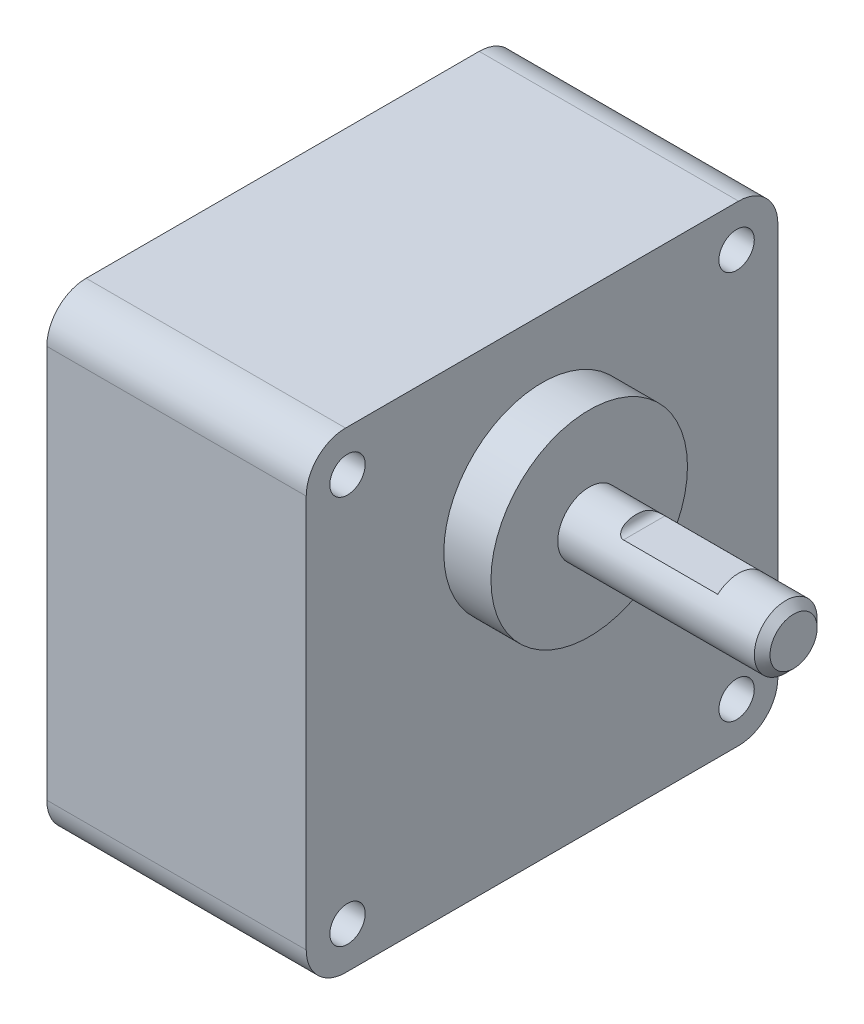
ISO-10303-21;
HEADER;
FILE_DESCRIPTION(('STEP AP214'),'2;1');
FILE_NAME('part.step','',(''),(''),'','','');
FILE_SCHEMA(('AUTOMOTIVE_DESIGN { 1 0 10303 214 1 1 1 1 }'));
ENDSEC;
DATA;
#1=APPLICATION_CONTEXT('core data for automotive mechanical design processes');
#2=APPLICATION_PROTOCOL_DEFINITION('international standard','automotive_design',2000,#1);
#3=PRODUCT_CONTEXT('',#1,'mechanical');
#4=PRODUCT('Part','Part','',(#3));
#5=PRODUCT_RELATED_PRODUCT_CATEGORY('part','',(#4));
#6=PRODUCT_DEFINITION_FORMATION('','',#4);
#7=PRODUCT_DEFINITION_CONTEXT('part definition',#1,'design');
#8=PRODUCT_DEFINITION('design','',#6,#7);
#9=PRODUCT_DEFINITION_SHAPE('','',#8);
#10=(LENGTH_UNIT() NAMED_UNIT(*) SI_UNIT(.MILLI.,.METRE.));
#11=(NAMED_UNIT(*) PLANE_ANGLE_UNIT() SI_UNIT($,.RADIAN.));
#12=(NAMED_UNIT(*) SI_UNIT($,.STERADIAN.) SOLID_ANGLE_UNIT());
#13=UNCERTAINTY_MEASURE_WITH_UNIT(LENGTH_MEASURE(1.E-05),#10,'distance_accuracy_value','');
#14=(GEOMETRIC_REPRESENTATION_CONTEXT(3) GLOBAL_UNCERTAINTY_ASSIGNED_CONTEXT((#13)) GLOBAL_UNIT_ASSIGNED_CONTEXT((#10,
#11,#12)) REPRESENTATION_CONTEXT('',''));
#15=CARTESIAN_POINT('',(0.,0.,0.));
#16=DIRECTION('',(0.,0.,1.));
#17=DIRECTION('',(1.,0.,0.));
#18=AXIS2_PLACEMENT_3D('',#15,#16,#17);
#19=CARTESIAN_POINT('',(39.,10.,0.));
#20=DIRECTION('',(1.,0.,0.));
#21=DIRECTION('',(0.,0.,-1.));
#22=AXIS2_PLACEMENT_3D('',#19,#20,#21);
#23=PLANE('',#22);
#24=CARTESIAN_POINT('',(39.,10.,0.));
#25=DIRECTION('',(1.,0.,0.));
#26=DIRECTION('',(0.,0.,-1.));
#27=AXIS2_PLACEMENT_3D('',#24,#25,#26);
#28=CIRCLE('',#27,12.5);
#29=CARTESIAN_POINT('',(39.,10.,-12.5));
#30=VERTEX_POINT('',#29);
#31=EDGE_CURVE('E285',#30,#30,#28,.T.);
#32=ORIENTED_EDGE('',*,*,#31,.T.);
#33=EDGE_LOOP('',(#32));
#34=FACE_BOUND('',#33,.T.);
#35=CARTESIAN_POINT('',(39.,10.,0.));
#36=DIRECTION('',(1.,0.,0.));
#37=DIRECTION('',(0.,0.,-1.));
#38=AXIS2_PLACEMENT_3D('',#35,#36,#37);
#39=CIRCLE('',#38,4.);
#40=CARTESIAN_POINT('',(39.,10.,-4.));
#41=VERTEX_POINT('',#40);
#42=EDGE_CURVE('E289',#41,#41,#39,.T.);
#43=ORIENTED_EDGE('',*,*,#42,.F.);
#44=EDGE_LOOP('',(#43));
#45=FACE_BOUND('',#44,.T.);
#46=ADVANCED_FACE('F16',(#34,#45),#23,.T.);
#47=CARTESIAN_POINT('',(33.,-25.,-25.));
#48=DIRECTION('',(1.,0.,0.));
#49=DIRECTION('',(0.,0.,-1.));
#50=AXIS2_PLACEMENT_3D('',#47,#48,#49);
#51=PLANE('',#50);
#52=CARTESIAN_POINT('',(33.,-25.,-25.));
#53=DIRECTION('',(1.,0.,0.));
#54=DIRECTION('',(0.,0.,-1.));
#55=AXIS2_PLACEMENT_3D('',#52,#53,#54);
#56=CIRCLE('',#55,5.);
#57=CARTESIAN_POINT('',(33.,-30.,-25.));
#58=VERTEX_POINT('',#57);
#59=CARTESIAN_POINT('',(33.,-25.,-30.));
#60=VERTEX_POINT('',#59);
#61=EDGE_CURVE('E142',#58,#60,#56,.T.);
#62=ORIENTED_EDGE('',*,*,#61,.T.);
#63=DIRECTION('',(0.,1.,0.));
#64=VECTOR('',#63,1.);
#65=CARTESIAN_POINT('',(33.,-25.,-30.));
#66=LINE('',#65,#64);
#67=CARTESIAN_POINT('',(33.,25.,-30.));
#68=VERTEX_POINT('',#67);
#69=EDGE_CURVE('E82',#60,#68,#66,.T.);
#70=ORIENTED_EDGE('',*,*,#69,.T.);
#71=CARTESIAN_POINT('',(33.,25.,-25.));
#72=DIRECTION('',(1.,0.,0.));
#73=DIRECTION('',(0.,0.,-1.));
#74=AXIS2_PLACEMENT_3D('',#71,#72,#73);
#75=CIRCLE('',#74,5.);
#76=CARTESIAN_POINT('',(33.,30.,-25.));
#77=VERTEX_POINT('',#76);
#78=EDGE_CURVE('E266',#68,#77,#75,.T.);
#79=ORIENTED_EDGE('',*,*,#78,.T.);
#80=DIRECTION('',(0.,0.,1.));
#81=VECTOR('',#80,1.);
#82=CARTESIAN_POINT('',(33.,30.,-25.));
#83=LINE('',#82,#81);
#84=CARTESIAN_POINT('',(33.,30.,25.));
#85=VERTEX_POINT('',#84);
#86=EDGE_CURVE('E268',#77,#85,#83,.T.);
#87=ORIENTED_EDGE('',*,*,#86,.T.);
#88=CARTESIAN_POINT('',(33.,25.,25.));
#89=DIRECTION('',(1.,0.,0.));
#90=DIRECTION('',(0.,0.,-1.));
#91=AXIS2_PLACEMENT_3D('',#88,#89,#90);
#92=CIRCLE('',#91,5.);
#93=CARTESIAN_POINT('',(33.,25.,30.));
#94=VERTEX_POINT('',#93);
#95=EDGE_CURVE('E105',#85,#94,#92,.T.);
#96=ORIENTED_EDGE('',*,*,#95,.T.);
#97=DIRECTION('',(0.,-1.,0.));
#98=VECTOR('',#97,1.);
#99=CARTESIAN_POINT('',(33.,25.,30.));
#100=LINE('',#99,#98);
#101=CARTESIAN_POINT('',(33.,-25.,30.));
#102=VERTEX_POINT('',#101);
#103=EDGE_CURVE('E97',#94,#102,#100,.T.);
#104=ORIENTED_EDGE('',*,*,#103,.T.);
#105=CARTESIAN_POINT('',(33.,-25.,25.));
#106=DIRECTION('',(1.,0.,0.));
#107=DIRECTION('',(0.,0.,-1.));
#108=AXIS2_PLACEMENT_3D('',#105,#106,#107);
#109=CIRCLE('',#108,5.);
#110=CARTESIAN_POINT('',(33.,-30.,25.));
#111=VERTEX_POINT('',#110);
#112=EDGE_CURVE('E102',#102,#111,#109,.T.);
#113=ORIENTED_EDGE('',*,*,#112,.T.);
#114=DIRECTION('',(0.,0.,-1.));
#115=VECTOR('',#114,1.);
#116=CARTESIAN_POINT('',(33.,-30.,25.));
#117=LINE('',#116,#115);
#118=EDGE_CURVE('E40',#111,#58,#117,.T.);
#119=ORIENTED_EDGE('',*,*,#118,.T.);
#120=EDGE_LOOP('',(#62,#70,#79,#87,#96,#104,#113,#119));
#121=FACE_BOUND('',#120,.T.);
#122=CARTESIAN_POINT('',(33.,24.7487373415292,24.7487373415292));
#123=DIRECTION('',(1.,0.,0.));
#124=DIRECTION('',(0.,0.,-1.));
#125=AXIS2_PLACEMENT_3D('',#122,#123,#124);
#126=CIRCLE('',#125,2.25);
#127=CARTESIAN_POINT('',(33.,24.7487373415292,22.4987373415292));
#128=VERTEX_POINT('',#127);
#129=EDGE_CURVE('E130',#128,#128,#126,.T.);
#130=ORIENTED_EDGE('',*,*,#129,.F.);
#131=EDGE_LOOP('',(#130));
#132=FACE_BOUND('',#131,.T.);
#133=CARTESIAN_POINT('',(33.,24.7487373415292,-24.7487373415292));
#134=DIRECTION('',(1.,0.,0.));
#135=DIRECTION('',(0.,0.,-1.));
#136=AXIS2_PLACEMENT_3D('',#133,#134,#135);
#137=CIRCLE('',#136,2.25);
#138=CARTESIAN_POINT('',(33.,24.7487373415292,-26.9987373415292));
#139=VERTEX_POINT('',#138);
#140=EDGE_CURVE('E276',#139,#139,#137,.T.);
#141=ORIENTED_EDGE('',*,*,#140,.F.);
#142=EDGE_LOOP('',(#141));
#143=FACE_BOUND('',#142,.T.);
#144=CARTESIAN_POINT('',(33.,-24.7487373415292,-24.7487373415292));
#145=DIRECTION('',(1.,0.,0.));
#146=DIRECTION('',(0.,0.,-1.));
#147=AXIS2_PLACEMENT_3D('',#144,#145,#146);
#148=CIRCLE('',#147,2.25);
#149=CARTESIAN_POINT('',(33.,-24.7487373415292,-26.9987373415292));
#150=VERTEX_POINT('',#149);
#151=EDGE_CURVE('E279',#150,#150,#148,.T.);
#152=ORIENTED_EDGE('',*,*,#151,.F.);
#153=EDGE_LOOP('',(#152));
#154=FACE_BOUND('',#153,.T.);
#155=CARTESIAN_POINT('',(33.,-24.7487373415292,24.7487373415292));
#156=DIRECTION('',(1.,0.,0.));
#157=DIRECTION('',(0.,0.,-1.));
#158=AXIS2_PLACEMENT_3D('',#155,#156,#157);
#159=CIRCLE('',#158,2.25);
#160=CARTESIAN_POINT('',(33.,-24.7487373415292,22.4987373415292));
#161=VERTEX_POINT('',#160);
#162=EDGE_CURVE('E282',#161,#161,#159,.T.);
#163=ORIENTED_EDGE('',*,*,#162,.F.);
#164=EDGE_LOOP('',(#163));
#165=FACE_BOUND('',#164,.T.);
#166=CARTESIAN_POINT('',(33.,10.,0.));
#167=DIRECTION('',(1.,0.,0.));
#168=DIRECTION('',(0.,0.,-1.));
#169=AXIS2_PLACEMENT_3D('',#166,#167,#168);
#170=CIRCLE('',#169,12.5);
#171=CARTESIAN_POINT('',(33.,10.,-12.5));
#172=VERTEX_POINT('',#171);
#173=EDGE_CURVE('E286',#172,#172,#170,.T.);
#174=ORIENTED_EDGE('',*,*,#173,.F.);
#175=EDGE_LOOP('',(#174));
#176=FACE_BOUND('',#175,.T.);
#177=ADVANCED_FACE('F99',(#121,#132,#143,#154,#165,#176),#51,.T.);
#178=CARTESIAN_POINT('',(33.,-25.,-25.));
#179=DIRECTION('',(-1.,0.,0.));
#180=DIRECTION('',(0.,0.,1.));
#181=AXIS2_PLACEMENT_3D('',#178,#179,#180);
#182=CYLINDRICAL_SURFACE('',#181,5.);
#183=CARTESIAN_POINT('',(0.,-25.,-25.));
#184=DIRECTION('',(1.,0.,0.));
#185=DIRECTION('',(0.,0.,-1.));
#186=AXIS2_PLACEMENT_3D('',#183,#184,#185);
#187=CIRCLE('',#186,5.);
#188=CARTESIAN_POINT('',(0.,-30.,-25.));
#189=VERTEX_POINT('',#188);
#190=CARTESIAN_POINT('',(0.,-25.,-30.));
#191=VERTEX_POINT('',#190);
#192=EDGE_CURVE('E126',#189,#191,#187,.T.);
#193=ORIENTED_EDGE('',*,*,#192,.T.);
#194=DIRECTION('',(-1.,0.,0.));
#195=VECTOR('',#194,1.);
#196=CARTESIAN_POINT('',(33.,-25.,-30.));
#197=LINE('',#196,#195);
#198=EDGE_CURVE('E155',#60,#191,#197,.T.);
#199=ORIENTED_EDGE('',*,*,#198,.F.);
#200=ORIENTED_EDGE('',*,*,#61,.F.);
#201=DIRECTION('',(-1.,0.,0.));
#202=VECTOR('',#201,1.);
#203=CARTESIAN_POINT('',(33.,-30.,-25.));
#204=LINE('',#203,#202);
#205=EDGE_CURVE('E122',#58,#189,#204,.T.);
#206=ORIENTED_EDGE('',*,*,#205,.T.);
#207=EDGE_LOOP('',(#193,#199,#200,#206));
#208=FACE_BOUND('',#207,.T.);
#209=ADVANCED_FACE('F204',(#208),#182,.T.);
#210=CARTESIAN_POINT('',(33.,-25.,-30.));
#211=DIRECTION('',(0.,0.,1.));
#212=DIRECTION('',(0.,-1.,0.));
#213=AXIS2_PLACEMENT_3D('',#210,#211,#212);
#214=PLANE('',#213);
#215=DIRECTION('',(0.,1.,0.));
#216=VECTOR('',#215,1.);
#217=CARTESIAN_POINT('',(0.,-25.,-30.));
#218=LINE('',#217,#216);
#219=CARTESIAN_POINT('',(0.,25.,-30.));
#220=VERTEX_POINT('',#219);
#221=EDGE_CURVE('E129',#191,#220,#218,.T.);
#222=ORIENTED_EDGE('',*,*,#221,.T.);
#223=DIRECTION('',(-1.,0.,0.));
#224=VECTOR('',#223,1.);
#225=CARTESIAN_POINT('',(33.,25.,-30.));
#226=LINE('',#225,#224);
#227=EDGE_CURVE('E152',#68,#220,#226,.T.);
#228=ORIENTED_EDGE('',*,*,#227,.F.);
#229=ORIENTED_EDGE('',*,*,#69,.F.);
#230=ORIENTED_EDGE('',*,*,#198,.T.);
#231=EDGE_LOOP('',(#222,#228,#229,#230));
#232=FACE_BOUND('',#231,.T.);
#233=ADVANCED_FACE('F250',(#232),#214,.F.);
#234=CARTESIAN_POINT('',(33.,25.,-25.));
#235=DIRECTION('',(-1.,0.,0.));
#236=DIRECTION('',(0.,0.,1.));
#237=AXIS2_PLACEMENT_3D('',#234,#235,#236);
#238=CYLINDRICAL_SURFACE('',#237,5.);
#239=CARTESIAN_POINT('',(0.,25.,-25.));
#240=DIRECTION('',(1.,0.,0.));
#241=DIRECTION('',(0.,0.,-1.));
#242=AXIS2_PLACEMENT_3D('',#239,#240,#241);
#243=CIRCLE('',#242,5.);
#244=CARTESIAN_POINT('',(0.,30.,-25.));
#245=VERTEX_POINT('',#244);
#246=EDGE_CURVE('E132',#220,#245,#243,.T.);
#247=ORIENTED_EDGE('',*,*,#246,.T.);
#248=DIRECTION('',(-1.,0.,0.));
#249=VECTOR('',#248,1.);
#250=CARTESIAN_POINT('',(33.,30.,-25.));
#251=LINE('',#250,#249);
#252=EDGE_CURVE('E149',#77,#245,#251,.T.);
#253=ORIENTED_EDGE('',*,*,#252,.F.);
#254=ORIENTED_EDGE('',*,*,#78,.F.);
#255=ORIENTED_EDGE('',*,*,#227,.T.);
#256=EDGE_LOOP('',(#247,#253,#254,#255));
#257=FACE_BOUND('',#256,.T.);
#258=ADVANCED_FACE('F246',(#257),#238,.T.);
#259=CARTESIAN_POINT('',(33.,30.,-25.));
#260=DIRECTION('',(0.,-1.,0.));
#261=DIRECTION('',(0.,0.,-1.));
#262=AXIS2_PLACEMENT_3D('',#259,#260,#261);
#263=PLANE('',#262);
#264=DIRECTION('',(0.,0.,1.));
#265=VECTOR('',#264,1.);
#266=CARTESIAN_POINT('',(0.,30.,-25.));
#267=LINE('',#266,#265);
#268=CARTESIAN_POINT('',(0.,30.,25.));
#269=VERTEX_POINT('',#268);
#270=EDGE_CURVE('E134',#245,#269,#267,.T.);
#271=ORIENTED_EDGE('',*,*,#270,.T.);
#272=DIRECTION('',(-1.,0.,0.));
#273=VECTOR('',#272,1.);
#274=CARTESIAN_POINT('',(33.,30.,25.));
#275=LINE('',#274,#273);
#276=EDGE_CURVE('E146',#85,#269,#275,.T.);
#277=ORIENTED_EDGE('',*,*,#276,.F.);
#278=ORIENTED_EDGE('',*,*,#86,.F.);
#279=ORIENTED_EDGE('',*,*,#252,.T.);
#280=EDGE_LOOP('',(#271,#277,#278,#279));
#281=FACE_BOUND('',#280,.T.);
#282=ADVANCED_FACE('F242',(#281),#263,.F.);
#283=CARTESIAN_POINT('',(33.,25.,25.));
#284=DIRECTION('',(-1.,0.,0.));
#285=DIRECTION('',(0.,0.,1.));
#286=AXIS2_PLACEMENT_3D('',#283,#284,#285);
#287=CYLINDRICAL_SURFACE('',#286,5.);
#288=CARTESIAN_POINT('',(0.,25.,25.));
#289=DIRECTION('',(1.,0.,0.));
#290=DIRECTION('',(0.,0.,-1.));
#291=AXIS2_PLACEMENT_3D('',#288,#289,#290);
#292=CIRCLE('',#291,5.);
#293=CARTESIAN_POINT('',(0.,25.,30.));
#294=VERTEX_POINT('',#293);
#295=EDGE_CURVE('E136',#269,#294,#292,.T.);
#296=ORIENTED_EDGE('',*,*,#295,.T.);
#297=DIRECTION('',(-1.,0.,0.));
#298=VECTOR('',#297,1.);
#299=CARTESIAN_POINT('',(33.,25.,30.));
#300=LINE('',#299,#298);
#301=EDGE_CURVE('E117',#94,#294,#300,.T.);
#302=ORIENTED_EDGE('',*,*,#301,.F.);
#303=ORIENTED_EDGE('',*,*,#95,.F.);
#304=ORIENTED_EDGE('',*,*,#276,.T.);
#305=EDGE_LOOP('',(#296,#302,#303,#304));
#306=FACE_BOUND('',#305,.T.);
#307=ADVANCED_FACE('F239',(#306),#287,.T.);
#308=CARTESIAN_POINT('',(33.,25.,30.));
#309=DIRECTION('',(0.,0.,-1.));
#310=DIRECTION('',(0.,1.,0.));
#311=AXIS2_PLACEMENT_3D('',#308,#309,#310);
#312=PLANE('',#311);
#313=DIRECTION('',(0.,-1.,0.));
#314=VECTOR('',#313,1.);
#315=CARTESIAN_POINT('',(0.,25.,30.));
#316=LINE('',#315,#314);
#317=CARTESIAN_POINT('',(0.,-25.,30.));
#318=VERTEX_POINT('',#317);
#319=EDGE_CURVE('E114',#294,#318,#316,.T.);
#320=ORIENTED_EDGE('',*,*,#319,.T.);
#321=DIRECTION('',(-1.,0.,0.));
#322=VECTOR('',#321,1.);
#323=CARTESIAN_POINT('',(33.,-25.,30.));
#324=LINE('',#323,#322);
#325=EDGE_CURVE('E111',#102,#318,#324,.T.);
#326=ORIENTED_EDGE('',*,*,#325,.F.);
#327=ORIENTED_EDGE('',*,*,#103,.F.);
#328=ORIENTED_EDGE('',*,*,#301,.T.);
#329=EDGE_LOOP('',(#320,#326,#327,#328));
#330=FACE_BOUND('',#329,.T.);
#331=ADVANCED_FACE('F112',(#330),#312,.F.);
#332=CARTESIAN_POINT('',(33.,-25.,25.));
#333=DIRECTION('',(-1.,0.,0.));
#334=DIRECTION('',(0.,0.,1.));
#335=AXIS2_PLACEMENT_3D('',#332,#333,#334);
#336=CYLINDRICAL_SURFACE('',#335,5.);
#337=CARTESIAN_POINT('',(0.,-25.,25.));
#338=DIRECTION('',(1.,0.,0.));
#339=DIRECTION('',(0.,0.,-1.));
#340=AXIS2_PLACEMENT_3D('',#337,#338,#339);
#341=CIRCLE('',#340,5.);
#342=CARTESIAN_POINT('',(0.,-30.,25.));
#343=VERTEX_POINT('',#342);
#344=EDGE_CURVE('E139',#318,#343,#341,.T.);
#345=ORIENTED_EDGE('',*,*,#344,.T.);
#346=DIRECTION('',(-1.,0.,0.));
#347=VECTOR('',#346,1.);
#348=CARTESIAN_POINT('',(33.,-30.,25.));
#349=LINE('',#348,#347);
#350=EDGE_CURVE('E118',#111,#343,#349,.T.);
#351=ORIENTED_EDGE('',*,*,#350,.F.);
#352=ORIENTED_EDGE('',*,*,#112,.F.);
#353=ORIENTED_EDGE('',*,*,#325,.T.);
#354=EDGE_LOOP('',(#345,#351,#352,#353));
#355=FACE_BOUND('',#354,.T.);
#356=ADVANCED_FACE('F120',(#355),#336,.T.);
#357=CARTESIAN_POINT('',(33.,-30.,25.));
#358=DIRECTION('',(0.,1.,0.));
#359=DIRECTION('',(0.,0.,1.));
#360=AXIS2_PLACEMENT_3D('',#357,#358,#359);
#361=PLANE('',#360);
#362=DIRECTION('',(0.,0.,-1.));
#363=VECTOR('',#362,1.);
#364=CARTESIAN_POINT('',(0.,-30.,25.));
#365=LINE('',#364,#363);
#366=EDGE_CURVE('E73',#343,#189,#365,.T.);
#367=ORIENTED_EDGE('',*,*,#366,.T.);
#368=ORIENTED_EDGE('',*,*,#205,.F.);
#369=ORIENTED_EDGE('',*,*,#118,.F.);
#370=ORIENTED_EDGE('',*,*,#350,.T.);
#371=EDGE_LOOP('',(#367,#368,#369,#370));
#372=FACE_BOUND('',#371,.T.);
#373=ADVANCED_FACE('F231',(#372),#361,.F.);
#374=CARTESIAN_POINT('',(0.,-25.,-25.));
#375=DIRECTION('',(1.,0.,0.));
#376=DIRECTION('',(0.,0.,-1.));
#377=AXIS2_PLACEMENT_3D('',#374,#375,#376);
#378=PLANE('',#377);
#379=CARTESIAN_POINT('',(0.,-24.7487373415292,-24.7487373415292));
#380=DIRECTION('',(1.,0.,0.));
#381=DIRECTION('',(0.,0.,-1.));
#382=AXIS2_PLACEMENT_3D('',#379,#380,#381);
#383=CIRCLE('',#382,2.25);
#384=CARTESIAN_POINT('',(0.,-24.7487373415292,-26.9987373415292));
#385=VERTEX_POINT('',#384);
#386=EDGE_CURVE('E306',#385,#385,#383,.T.);
#387=ORIENTED_EDGE('',*,*,#386,.T.);
#388=EDGE_LOOP('',(#387));
#389=FACE_BOUND('',#388,.T.);
#390=CARTESIAN_POINT('',(0.,-24.7487373415292,24.7487373415292));
#391=DIRECTION('',(1.,0.,0.));
#392=DIRECTION('',(0.,0.,-1.));
#393=AXIS2_PLACEMENT_3D('',#390,#391,#392);
#394=CIRCLE('',#393,2.25);
#395=CARTESIAN_POINT('',(0.,-24.7487373415292,22.4987373415292));
#396=VERTEX_POINT('',#395);
#397=EDGE_CURVE('E303',#396,#396,#394,.T.);
#398=ORIENTED_EDGE('',*,*,#397,.T.);
#399=EDGE_LOOP('',(#398));
#400=FACE_BOUND('',#399,.T.);
#401=CARTESIAN_POINT('',(0.,24.7487373415292,24.7487373415292));
#402=DIRECTION('',(1.,0.,0.));
#403=DIRECTION('',(0.,0.,-1.));
#404=AXIS2_PLACEMENT_3D('',#401,#402,#403);
#405=CIRCLE('',#404,2.25);
#406=CARTESIAN_POINT('',(0.,24.7487373415292,22.4987373415292));
#407=VERTEX_POINT('',#406);
#408=EDGE_CURVE('E300',#407,#407,#405,.T.);
#409=ORIENTED_EDGE('',*,*,#408,.T.);
#410=EDGE_LOOP('',(#409));
#411=FACE_BOUND('',#410,.T.);
#412=CARTESIAN_POINT('',(0.,24.7487373415292,-24.7487373415292));
#413=DIRECTION('',(1.,0.,0.));
#414=DIRECTION('',(0.,0.,-1.));
#415=AXIS2_PLACEMENT_3D('',#412,#413,#414);
#416=CIRCLE('',#415,2.25);
#417=CARTESIAN_POINT('',(0.,24.7487373415292,-26.9987373415292));
#418=VERTEX_POINT('',#417);
#419=EDGE_CURVE('E296',#418,#418,#416,.T.);
#420=ORIENTED_EDGE('',*,*,#419,.T.);
#421=EDGE_LOOP('',(#420));
#422=FACE_BOUND('',#421,.T.);
#423=ORIENTED_EDGE('',*,*,#192,.F.);
#424=ORIENTED_EDGE('',*,*,#366,.F.);
#425=ORIENTED_EDGE('',*,*,#344,.F.);
#426=ORIENTED_EDGE('',*,*,#319,.F.);
#427=ORIENTED_EDGE('',*,*,#295,.F.);
#428=ORIENTED_EDGE('',*,*,#270,.F.);
#429=ORIENTED_EDGE('',*,*,#246,.F.);
#430=ORIENTED_EDGE('',*,*,#221,.F.);
#431=EDGE_LOOP('',(#423,#424,#425,#426,#427,#428,#429,#430));
#432=FACE_BOUND('',#431,.T.);
#433=ADVANCED_FACE('F226',(#389,#400,#411,#422,#432),#378,.F.);
#434=CARTESIAN_POINT('',(7.,24.7487373415292,24.7487373415292));
#435=DIRECTION('',(1.,0.,0.));
#436=DIRECTION('',(0.,0.,-1.));
#437=AXIS2_PLACEMENT_3D('',#434,#435,#436);
#438=CYLINDRICAL_SURFACE('',#437,2.25);
#439=ORIENTED_EDGE('',*,*,#129,.T.);
#440=EDGE_LOOP('',(#439));
#441=FACE_BOUND('',#440,.T.);
#442=ORIENTED_EDGE('',*,*,#408,.F.);
#443=EDGE_LOOP('',(#442));
#444=FACE_BOUND('',#443,.T.);
#445=ADVANCED_FACE('F223',(#441,#444),#438,.F.);
#446=CARTESIAN_POINT('',(7.,24.7487373415292,-24.7487373415292));
#447=DIRECTION('',(1.,0.,0.));
#448=DIRECTION('',(0.,0.,-1.));
#449=AXIS2_PLACEMENT_3D('',#446,#447,#448);
#450=CYLINDRICAL_SURFACE('',#449,2.25);
#451=ORIENTED_EDGE('',*,*,#140,.T.);
#452=EDGE_LOOP('',(#451));
#453=FACE_BOUND('',#452,.T.);
#454=ORIENTED_EDGE('',*,*,#419,.F.);
#455=EDGE_LOOP('',(#454));
#456=FACE_BOUND('',#455,.T.);
#457=ADVANCED_FACE('F219',(#453,#456),#450,.F.);
#458=CARTESIAN_POINT('',(7.,-24.7487373415292,-24.7487373415292));
#459=DIRECTION('',(1.,0.,0.));
#460=DIRECTION('',(0.,0.,-1.));
#461=AXIS2_PLACEMENT_3D('',#458,#459,#460);
#462=CYLINDRICAL_SURFACE('',#461,2.25);
#463=ORIENTED_EDGE('',*,*,#151,.T.);
#464=EDGE_LOOP('',(#463));
#465=FACE_BOUND('',#464,.T.);
#466=ORIENTED_EDGE('',*,*,#386,.F.);
#467=EDGE_LOOP('',(#466));
#468=FACE_BOUND('',#467,.T.);
#469=ADVANCED_FACE('F215',(#465,#468),#462,.F.);
#470=CARTESIAN_POINT('',(7.,-24.7487373415292,24.7487373415292));
#471=DIRECTION('',(1.,0.,0.));
#472=DIRECTION('',(0.,0.,-1.));
#473=AXIS2_PLACEMENT_3D('',#470,#471,#472);
#474=CYLINDRICAL_SURFACE('',#473,2.25);
#475=ORIENTED_EDGE('',*,*,#162,.T.);
#476=EDGE_LOOP('',(#475));
#477=FACE_BOUND('',#476,.T.);
#478=ORIENTED_EDGE('',*,*,#397,.F.);
#479=EDGE_LOOP('',(#478));
#480=FACE_BOUND('',#479,.T.);
#481=ADVANCED_FACE('F211',(#477,#480),#474,.F.);
#482=CARTESIAN_POINT('',(39.,10.,0.));
#483=DIRECTION('',(-1.,0.,0.));
#484=DIRECTION('',(0.,0.,1.));
#485=AXIS2_PLACEMENT_3D('',#482,#483,#484);
#486=CYLINDRICAL_SURFACE('',#485,12.5);
#487=ORIENTED_EDGE('',*,*,#31,.F.);
#488=EDGE_LOOP('',(#487));
#489=FACE_BOUND('',#488,.T.);
#490=ORIENTED_EDGE('',*,*,#173,.T.);
#491=EDGE_LOOP('',(#490));
#492=FACE_BOUND('',#491,.T.);
#493=ADVANCED_FACE('F196',(#489,#492),#486,.T.);
#494=CARTESIAN_POINT('',(65.,10.,0.));
#495=DIRECTION('',(-1.,0.,0.));
#496=DIRECTION('',(0.,0.,1.));
#497=AXIS2_PLACEMENT_3D('',#494,#495,#496);
#498=CYLINDRICAL_SURFACE('',#497,4.);
#499=CARTESIAN_POINT('',(58.,10.,0.));
#500=DIRECTION('',(1.,0.,0.));
#501=DIRECTION('',(0.,0.,-1.));
#502=AXIS2_PLACEMENT_3D('',#499,#500,#501);
#503=CIRCLE('',#502,4.);
#504=CARTESIAN_POINT('',(58.,13.,-2.64575131106458));
#505=VERTEX_POINT('',#504);
#506=CARTESIAN_POINT('',(58.,13.,2.64575131106458));
#507=VERTEX_POINT('',#506);
#508=EDGE_CURVE('E166',#505,#507,#503,.T.);
#509=ORIENTED_EDGE('',*,*,#508,.T.);
#510=DIRECTION('',(-1.,0.,0.));
#511=VECTOR('',#510,1.);
#512=CARTESIAN_POINT('',(65.,13.,2.64575131106458));
#513=LINE('',#512,#511);
#514=CARTESIAN_POINT('',(46.,13.,2.64575131106458));
#515=VERTEX_POINT('',#514);
#516=EDGE_CURVE('E11',#507,#515,#513,.T.);
#517=ORIENTED_EDGE('',*,*,#516,.T.);
#518=CARTESIAN_POINT('',(46.,13.,2.64575131106458));
#519=CARTESIAN_POINT('',(45.9791771017932,12.9999972186577,2.64575264763035));
#520=CARTESIAN_POINT('',(45.9583667102621,13.0006510441432,2.64501325874664));
#521=CARTESIAN_POINT('',(45.9169420901107,13.0032397139056,2.64207438655804));
#522=CARTESIAN_POINT('',(45.8963277487733,13.0051737704994,2.6398758010454));
#523=CARTESIAN_POINT('',(45.8353426194659,13.0128059973504,2.63117123632498));
#524=CARTESIAN_POINT('',(45.7954723155137,13.0203354306586,2.62255555932587));
#525=CARTESIAN_POINT('',(45.7184409175593,13.0396337346219,2.60016152433258));
#526=CARTESIAN_POINT('',(45.681274622714,13.0513941935277,2.58639340779308));
#527=CARTESIAN_POINT('',(45.6102337240711,13.0783011290155,2.55431036258326));
#528=CARTESIAN_POINT('',(45.5763651394892,13.0934536367026,2.53598732872242));
#529=CARTESIAN_POINT('',(45.5013130031302,13.1318700010503,2.48849477917766));
#530=CARTESIAN_POINT('',(45.4616309088325,13.156129633108,2.4577634473411));
#531=CARTESIAN_POINT('',(45.3890245884467,13.207103053019,2.39087242504342));
#532=CARTESIAN_POINT('',(45.356112321799,13.23382106535,2.35470332008576));
#533=CARTESIAN_POINT('',(45.2821622461198,13.3012267000897,2.25979946283149));
#534=CARTESIAN_POINT('',(45.2448310839982,13.3424519905752,2.19857897158426));
#535=CARTESIAN_POINT('',(45.1811894601627,13.4236157948991,2.06994851416954));
#536=CARTESIAN_POINT('',(45.1549014336162,13.4635515384974,2.00252628388302));
#537=CARTESIAN_POINT('',(45.1139613798603,13.534846464536,1.87336733874476));
#538=CARTESIAN_POINT('',(45.0981819621234,13.5666147502962,1.81219964521157));
#539=CARTESIAN_POINT('',(45.0714484532797,13.6273162789514,1.68742267036966));
#540=CARTESIAN_POINT('',(45.060497829725,13.6562474729785,1.62381167004308));
#541=CARTESIAN_POINT('',(45.0422520561387,13.7109476554679,1.49459112155717));
#542=CARTESIAN_POINT('',(45.0349646856023,13.7367098271735,1.42897763139659));
#543=CARTESIAN_POINT('',(45.0231170022648,13.7847995584408,1.29625567319227));
#544=CARTESIAN_POINT('',(45.0185575172255,13.8071260739466,1.22914675777093));
#545=CARTESIAN_POINT('',(45.0093994357966,13.8594346288817,1.05675254420099));
#546=CARTESIAN_POINT('',(45.0061398286207,13.8869370069321,0.95063692045046));
#547=CARTESIAN_POINT('',(45.0019687385972,13.9331504645254,0.736441011683952));
#548=CARTESIAN_POINT('',(45.0010583286396,13.9518575240138,0.628359851681733));
#549=CARTESIAN_POINT('',(45.0000911568006,13.9803440873264,0.410956076560055));
#550=CARTESIAN_POINT('',(45.000034907967,13.9901182223177,0.301632754785532));
#551=CARTESIAN_POINT('',(44.9999863969259,14.0006503506504,0.0825776217680719));
#552=CARTESIAN_POINT('',(44.9999941209518,14.0014102836721,-0.0271540965121697));
#553=CARTESIAN_POINT('',(45.0000114460675,13.9938698465979,-0.247613686630679));
#554=CARTESIAN_POINT('',(45.0000210683898,13.9854616086854,-0.358337883798174));
#555=CARTESIAN_POINT('',(45.0007373139181,13.9594661259573,-0.578744445657794));
#556=CARTESIAN_POINT('',(45.0014441886021,13.941875570435,-0.688426420041142));
#557=CARTESIAN_POINT('',(45.0049994468546,13.8977092651942,-0.905596700125269));
#558=CARTESIAN_POINT('',(45.0078414175879,13.871160552889,-1.01309058676689));
#559=CARTESIAN_POINT('',(45.0178470845217,13.8093177656038,-1.22526882041118));
#560=CARTESIAN_POINT('',(45.0250068440294,13.7740316740775,-1.32995563602703));
#561=CARTESIAN_POINT('',(45.0452962961267,13.7003269792878,-1.52208994372318));
#562=CARTESIAN_POINT('',(45.0575311845331,13.6629083455197,-1.61001224680159));
#563=CARTESIAN_POINT('',(45.0903242497436,13.582399306136,-1.78196607247139));
#564=CARTESIAN_POINT('',(45.1108970596662,13.5392990193707,-1.86599046376549));
#565=CARTESIAN_POINT('',(45.1508070404801,13.4712553965178,-1.98812044184688));
#566=CARTESIAN_POINT('',(45.1657795253938,13.4478025356239,-2.02849294321315));
#567=CARTESIAN_POINT('',(45.1993269465626,13.4001891511565,-2.10732739304204));
#568=CARTESIAN_POINT('',(45.2179031978185,13.3760283720069,-2.14578863763954));
#569=CARTESIAN_POINT('',(45.2591176954024,13.3276172516075,-2.22011738485712));
#570=CARTESIAN_POINT('',(45.281735838605,13.3033679104223,-2.25599654435262));
#571=CARTESIAN_POINT('',(45.3316132867519,13.2553828549345,-2.32470082681422));
#572=CARTESIAN_POINT('',(45.358866311685,13.2316464939833,-2.35752999049742));
#573=CARTESIAN_POINT('',(45.4177848469809,13.1861340435569,-2.41867077723183));
#574=CARTESIAN_POINT('',(45.449332721797,13.1643251615946,-2.44706985172821));
#575=CARTESIAN_POINT('',(45.5174899411637,13.1232074393839,-2.49933629808055));
#576=CARTESIAN_POINT('',(45.5540993191641,13.1038986156592,-2.52320363998512));
#577=CARTESIAN_POINT('',(45.6325455676798,13.0689578085074,-2.56559226094059));
#578=CARTESIAN_POINT('',(45.6744349849912,13.0533681196654,-2.5840525425415));
#579=CARTESIAN_POINT('',(45.7621278057367,13.0276377214543,-2.6141556024431));
#580=CARTESIAN_POINT('',(45.8079209223346,13.0174831746137,-2.62581570036591));
#581=CARTESIAN_POINT('',(45.8785921473562,13.0071031310881,-2.63768026327875));
#582=CARTESIAN_POINT('',(45.9026840851055,13.0044505709878,-2.64069841459213));
#583=CARTESIAN_POINT('',(45.9511771744564,13.0008957069844,-2.64473591728022));
#584=CARTESIAN_POINT('',(45.9755785086553,12.9999944901744,-2.64575402719413));
#585=CARTESIAN_POINT('',(46.,13.,-2.64575131106458));
#586=B_SPLINE_CURVE_WITH_KNOTS('',3,(#518,#519,#520,#521,#522,#523,#524,#525,#526,#527,#528,
#529,#530,#531,#532,#533,#534,#535,#536,#537,#538,#539,#540,#541,#542,#543,#544,#545,#546,#547,
#548,#549,#550,#551,#552,#553,#554,#555,#556,#557,#558,#559,#560,#561,#562,#563,#564,#565,#566,
#567,#568,#569,#570,#571,#572,#573,#574,#575,#576,#577,#578,#579,#580,#581,#582,#583,#584,#585),
.UNSPECIFIED.,.F.,.F.,(4,2,2,2,2,2,2,2,2,2,2,2,2,2,2,2,2,2,2,2,2,2,2,2,2,2,2,2,2,2,2,2,2,4),(0.,
0.0624213818929954,0.124804393669029,0.248514890479606,0.371980784030147,0.495667970086387,
0.661980300924832,0.828583959147531,1.0753269348793,1.32256879582881,1.53439454234992,
1.7463721539891,1.95879805156592,2.17128837596743,2.49984523338545,2.82855211782845,
3.15745643078095,3.48628996866276,3.81903454636199,4.15189917887314,4.48376801806351,
4.81533473627201,5.10389463563054,5.3929631681311,5.53992129300831,5.68693314355225,
5.83323318261978,5.9793365498248,6.12203495676124,6.26473430679552,6.40898639615408,
6.55286946204049,6.62601280639636,6.69920153778216),.UNSPECIFIED.);
#587=CARTESIAN_POINT('',(46.,13.,-2.64575131106459));
#588=VERTEX_POINT('',#587);
#589=EDGE_CURVE('E24',#515,#588,#586,.T.);
#590=ORIENTED_EDGE('',*,*,#589,.T.);
#591=DIRECTION('',(-1.,0.,0.));
#592=VECTOR('',#591,1.);
#593=CARTESIAN_POINT('',(65.,13.,-2.64575131106458));
#594=LINE('',#593,#592);
#595=EDGE_CURVE('E163',#588,#505,#594,.F.);
#596=ORIENTED_EDGE('',*,*,#595,.T.);
#597=EDGE_LOOP('',(#509,#517,#590,#596));
#598=FACE_BOUND('',#597,.T.);
#599=CARTESIAN_POINT('',(64.,10.,0.));
#600=DIRECTION('',(1.,0.,0.));
#601=DIRECTION('',(0.,0.,-1.));
#602=AXIS2_PLACEMENT_3D('',#599,#600,#601);
#603=CIRCLE('',#602,4.);
#604=CARTESIAN_POINT('',(64.,10.,-4.));
#605=VERTEX_POINT('',#604);
#606=EDGE_CURVE('E160',#605,#605,#603,.F.);
#607=ORIENTED_EDGE('',*,*,#606,.T.);
#608=EDGE_LOOP('',(#607));
#609=FACE_BOUND('',#608,.T.);
#610=ORIENTED_EDGE('',*,*,#42,.T.);
#611=EDGE_LOOP('',(#610));
#612=FACE_BOUND('',#611,.T.);
#613=ADVANCED_FACE('F174',(#598,#609,#612),#498,.T.);
#614=CARTESIAN_POINT('',(65.,10.,0.));
#615=DIRECTION('',(1.,0.,0.));
#616=DIRECTION('',(0.,0.,-1.));
#617=AXIS2_PLACEMENT_3D('',#614,#615,#616);
#618=PLANE('',#617);
#619=CARTESIAN_POINT('',(65.,10.,0.));
#620=DIRECTION('',(1.,0.,0.));
#621=DIRECTION('',(0.,0.,-1.));
#622=AXIS2_PLACEMENT_3D('',#619,#620,#621);
#623=CIRCLE('',#622,3.00000000000007);
#624=CARTESIAN_POINT('',(65.,10.,-3.00000000000007));
#625=VERTEX_POINT('',#624);
#626=EDGE_CURVE('E157',#625,#625,#623,.T.);
#627=ORIENTED_EDGE('',*,*,#626,.T.);
#628=EDGE_LOOP('',(#627));
#629=FACE_BOUND('',#628,.T.);
#630=ADVANCED_FACE('F186',(#629),#618,.T.);
#631=CARTESIAN_POINT('',(65.,10.,0.));
#632=DIRECTION('',(-1.,0.,0.));
#633=DIRECTION('',(0.,0.,1.));
#634=AXIS2_PLACEMENT_3D('',#631,#632,#633);
#635=CONICAL_SURFACE('',#634,3.00000000000007,0.785398163397447);
#636=ORIENTED_EDGE('',*,*,#606,.F.);
#637=EDGE_LOOP('',(#636));
#638=FACE_BOUND('',#637,.T.);
#639=ORIENTED_EDGE('',*,*,#626,.F.);
#640=EDGE_LOOP('',(#639));
#641=FACE_BOUND('',#640,.T.);
#642=ADVANCED_FACE('F18',(#638,#641),#635,.T.);
#643=CARTESIAN_POINT('',(46.,14.,-23.));
#644=DIRECTION('',(0.,0.,1.));
#645=DIRECTION('',(1.,0.,0.));
#646=AXIS2_PLACEMENT_3D('',#643,#644,#645);
#647=CYLINDRICAL_SURFACE('',#646,1.);
#648=DIRECTION('',(0.,0.,1.));
#649=VECTOR('',#648,1.);
#650=CARTESIAN_POINT('',(46.,13.,-23.));
#651=LINE('',#650,#649);
#652=EDGE_CURVE('E293',#588,#515,#651,.T.);
#653=ORIENTED_EDGE('',*,*,#652,.F.);
#654=ORIENTED_EDGE('',*,*,#589,.F.);
#655=EDGE_LOOP('',(#653,#654));
#656=FACE_BOUND('',#655,.T.);
#657=ADVANCED_FACE('F178',(#656),#647,.F.);
#658=CARTESIAN_POINT('',(58.,13.,-23.));
#659=DIRECTION('',(1.,0.,0.));
#660=DIRECTION('',(0.,0.,-1.));
#661=AXIS2_PLACEMENT_3D('',#658,#659,#660);
#662=PLANE('',#661);
#663=DIRECTION('',(0.,0.,1.));
#664=VECTOR('',#663,1.);
#665=CARTESIAN_POINT('',(58.,13.,-23.));
#666=LINE('',#665,#664);
#667=EDGE_CURVE('E31',#505,#507,#666,.T.);
#668=ORIENTED_EDGE('',*,*,#667,.T.);
#669=ORIENTED_EDGE('',*,*,#508,.F.);
#670=EDGE_LOOP('',(#668,#669));
#671=FACE_BOUND('',#670,.T.);
#672=ADVANCED_FACE('F182',(#671),#662,.F.);
#673=CARTESIAN_POINT('',(46.,13.,-23.));
#674=DIRECTION('',(0.,-1.,0.));
#675=DIRECTION('',(0.,0.,-1.));
#676=AXIS2_PLACEMENT_3D('',#673,#674,#675);
#677=PLANE('',#676);
#678=ORIENTED_EDGE('',*,*,#667,.F.);
#679=ORIENTED_EDGE('',*,*,#595,.F.);
#680=ORIENTED_EDGE('',*,*,#652,.T.);
#681=ORIENTED_EDGE('',*,*,#516,.F.);
#682=EDGE_LOOP('',(#678,#679,#680,#681));
#683=FACE_BOUND('',#682,.T.);
#684=ADVANCED_FACE('F184',(#683),#677,.F.);
#685=CLOSED_SHELL('',(#46,#177,#209,#233,#258,#282,#307,#331,#356,#373,#433,#445,#457,#469,#481,
#493,#613,#630,#642,#657,#672,#684));
#686=MANIFOLD_SOLID_BREP('B1',#685);
#687=ADVANCED_BREP_SHAPE_REPRESENTATION('',(#18,#686),#14);
#688=SHAPE_DEFINITION_REPRESENTATION(#9,#687);
ENDSEC;
END-ISO-10303-21;
